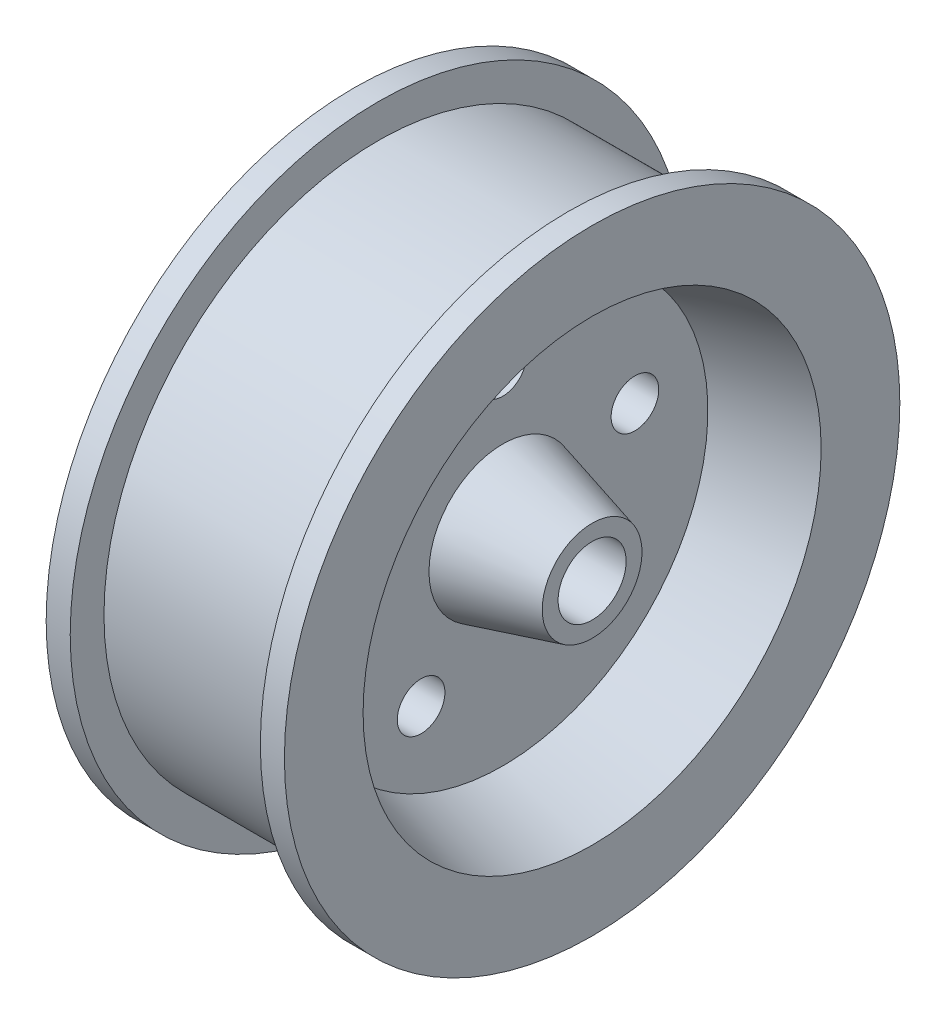
ISO-10303-21;
HEADER;
FILE_DESCRIPTION(('STEP AP214'),'2;1');
FILE_NAME('part.step','',(''),(''),'','','');
FILE_SCHEMA(('AUTOMOTIVE_DESIGN { 1 0 10303 214 1 1 1 1 }'));
ENDSEC;
DATA;
#1=APPLICATION_CONTEXT('core data for automotive mechanical design processes');
#2=APPLICATION_PROTOCOL_DEFINITION('international standard','automotive_design',2000,#1);
#3=PRODUCT_CONTEXT('',#1,'mechanical');
#4=PRODUCT('Part','Part','',(#3));
#5=PRODUCT_RELATED_PRODUCT_CATEGORY('part','',(#4));
#6=PRODUCT_DEFINITION_FORMATION('','',#4);
#7=PRODUCT_DEFINITION_CONTEXT('part definition',#1,'design');
#8=PRODUCT_DEFINITION('design','',#6,#7);
#9=PRODUCT_DEFINITION_SHAPE('','',#8);
#10=(LENGTH_UNIT() NAMED_UNIT(*) SI_UNIT(.MILLI.,.METRE.));
#11=(NAMED_UNIT(*) PLANE_ANGLE_UNIT() SI_UNIT($,.RADIAN.));
#12=(NAMED_UNIT(*) SI_UNIT($,.STERADIAN.) SOLID_ANGLE_UNIT());
#13=UNCERTAINTY_MEASURE_WITH_UNIT(LENGTH_MEASURE(1.E-05),#10,'distance_accuracy_value','');
#14=(GEOMETRIC_REPRESENTATION_CONTEXT(3) GLOBAL_UNCERTAINTY_ASSIGNED_CONTEXT((#13)) GLOBAL_UNIT_ASSIGNED_CONTEXT((#10,
#11,#12)) REPRESENTATION_CONTEXT('',''));
#15=CARTESIAN_POINT('',(0.,0.,0.));
#16=DIRECTION('',(0.,0.,1.));
#17=DIRECTION('',(1.,0.,0.));
#18=AXIS2_PLACEMENT_3D('',#15,#16,#17);
#19=CARTESIAN_POINT('',(0.,15.9532019704434,0.));
#20=DIRECTION('',(1.,0.,0.));
#21=DIRECTION('',(0.,0.,-1.));
#22=AXIS2_PLACEMENT_3D('',#19,#20,#21);
#23=PLANE('',#22);
#24=CARTESIAN_POINT('',(0.,0.,0.));
#25=DIRECTION('',(-1.,0.,0.));
#26=DIRECTION('',(0.,0.,1.));
#27=AXIS2_PLACEMENT_3D('',#24,#25,#26);
#28=CIRCLE('',#27,10.8857142857143);
#29=CARTESIAN_POINT('',(0.,0.,10.8857142857143));
#30=VERTEX_POINT('',#29);
#31=EDGE_CURVE('E10',#30,#30,#28,.T.);
#32=ORIENTED_EDGE('',*,*,#31,.F.);
#33=EDGE_LOOP('',(#32));
#34=FACE_BOUND('',#33,.T.);
#35=CARTESIAN_POINT('',(0.,0.,0.));
#36=DIRECTION('',(-1.,0.,0.));
#37=DIRECTION('',(0.,0.,1.));
#38=AXIS2_PLACEMENT_3D('',#35,#36,#37);
#39=CIRCLE('',#38,15.9532019704434);
#40=CARTESIAN_POINT('',(0.,0.,15.9532019704434));
#41=VERTEX_POINT('',#40);
#42=EDGE_CURVE('E110',#41,#41,#39,.T.);
#43=ORIENTED_EDGE('',*,*,#42,.T.);
#44=EDGE_LOOP('',(#43));
#45=FACE_BOUND('',#44,.T.);
#46=ADVANCED_FACE('F43',(#34,#45),#23,.F.);
#47=CARTESIAN_POINT('',(0.,0.,0.));
#48=DIRECTION('',(-1.,0.,0.));
#49=DIRECTION('',(0.,0.,1.));
#50=AXIS2_PLACEMENT_3D('',#47,#48,#49);
#51=CYLINDRICAL_SURFACE('',#50,10.8857142857143);
#52=CARTESIAN_POINT('',(76.2,0.,0.));
#53=DIRECTION('',(-1.,0.,0.));
#54=DIRECTION('',(0.,0.,1.));
#55=AXIS2_PLACEMENT_3D('',#52,#53,#54);
#56=CIRCLE('',#55,10.8857142857143);
#57=CARTESIAN_POINT('',(76.2,0.,10.8857142857143));
#58=VERTEX_POINT('',#57);
#59=EDGE_CURVE('E50',#58,#58,#56,.T.);
#60=ORIENTED_EDGE('',*,*,#59,.F.);
#61=EDGE_LOOP('',(#60));
#62=FACE_BOUND('',#61,.T.);
#63=ORIENTED_EDGE('',*,*,#31,.T.);
#64=EDGE_LOOP('',(#63));
#65=FACE_BOUND('',#64,.T.);
#66=ADVANCED_FACE('F244',(#62,#65),#51,.F.);
#67=CARTESIAN_POINT('',(76.2,15.9532019704434,0.));
#68=DIRECTION('',(-1.,0.,0.));
#69=DIRECTION('',(0.,0.,1.));
#70=AXIS2_PLACEMENT_3D('',#67,#68,#69);
#71=PLANE('',#70);
#72=CARTESIAN_POINT('',(76.2,0.,0.));
#73=DIRECTION('',(-1.,0.,0.));
#74=DIRECTION('',(0.,0.,1.));
#75=AXIS2_PLACEMENT_3D('',#72,#73,#74);
#76=CIRCLE('',#75,15.9532019704434);
#77=CARTESIAN_POINT('',(76.2,0.,15.9532019704434));
#78=VERTEX_POINT('',#77);
#79=EDGE_CURVE('E55',#78,#78,#76,.T.);
#80=ORIENTED_EDGE('',*,*,#79,.F.);
#81=EDGE_LOOP('',(#80));
#82=FACE_BOUND('',#81,.T.);
#83=ORIENTED_EDGE('',*,*,#59,.T.);
#84=EDGE_LOOP('',(#83));
#85=FACE_BOUND('',#84,.T.);
#86=ADVANCED_FACE('F239',(#82,#85),#71,.F.);
#87=CARTESIAN_POINT('',(76.2,0.,0.));
#88=DIRECTION('',(-1.,0.,0.));
#89=DIRECTION('',(0.,0.,1.));
#90=AXIS2_PLACEMENT_3D('',#87,#88,#89);
#91=CONICAL_SURFACE('',#90,15.9532019704434,0.261799387799147);
#92=CARTESIAN_POINT('',(47.625,0.,0.));
#93=DIRECTION('',(-1.,0.,0.));
#94=DIRECTION('',(0.,0.,1.));
#95=AXIS2_PLACEMENT_3D('',#92,#93,#94);
#96=CIRCLE('',#95,23.6098501441626);
#97=CARTESIAN_POINT('',(47.625,0.,23.6098501441626));
#98=VERTEX_POINT('',#97);
#99=EDGE_CURVE('E60',#98,#98,#96,.T.);
#100=ORIENTED_EDGE('',*,*,#99,.F.);
#101=EDGE_LOOP('',(#100));
#102=FACE_BOUND('',#101,.T.);
#103=ORIENTED_EDGE('',*,*,#79,.T.);
#104=EDGE_LOOP('',(#103));
#105=FACE_BOUND('',#104,.T.);
#106=ADVANCED_FACE('F232',(#102,#105),#91,.T.);
#107=CARTESIAN_POINT('',(47.625,65.5989537967241,0.));
#108=DIRECTION('',(-1.,0.,0.));
#109=DIRECTION('',(0.,0.,1.));
#110=AXIS2_PLACEMENT_3D('',#107,#108,#109);
#111=PLANE('',#110);
#112=CARTESIAN_POINT('',(47.625,13.7358053999663,-42.2744621493196));
#113=DIRECTION('',(-1.,0.,0.));
#114=DIRECTION('',(0.,0.,1.));
#115=AXIS2_PLACEMENT_3D('',#112,#113,#114);
#116=CIRCLE('',#115,7.62);
#117=CARTESIAN_POINT('',(47.625,13.7358053999663,-34.6544621493196));
#118=VERTEX_POINT('',#117);
#119=EDGE_CURVE('E122',#118,#118,#116,.T.);
#120=ORIENTED_EDGE('',*,*,#119,.T.);
#121=EDGE_LOOP('',(#120));
#122=FACE_BOUND('',#121,.T.);
#123=CARTESIAN_POINT('',(47.625,-35.9608053999666,-26.1270544644002));
#124=DIRECTION('',(-1.,0.,0.));
#125=DIRECTION('',(0.,0.,1.));
#126=AXIS2_PLACEMENT_3D('',#123,#124,#125);
#127=CIRCLE('',#126,7.62);
#128=CARTESIAN_POINT('',(47.625,-35.9608053999666,-18.5070544644002));
#129=VERTEX_POINT('',#128);
#130=EDGE_CURVE('E126',#129,#129,#127,.T.);
#131=ORIENTED_EDGE('',*,*,#130,.T.);
#132=EDGE_LOOP('',(#131));
#133=FACE_BOUND('',#132,.T.);
#134=CARTESIAN_POINT('',(47.625,-35.9608053999662,26.1270544644007));
#135=DIRECTION('',(-1.,0.,0.));
#136=DIRECTION('',(0.,0.,1.));
#137=AXIS2_PLACEMENT_3D('',#134,#135,#136);
#138=CIRCLE('',#137,7.62);
#139=CARTESIAN_POINT('',(47.625,-35.9608053999662,33.7470544644007));
#140=VERTEX_POINT('',#139);
#141=EDGE_CURVE('E130',#140,#140,#138,.T.);
#142=ORIENTED_EDGE('',*,*,#141,.T.);
#143=EDGE_LOOP('',(#142));
#144=FACE_BOUND('',#143,.T.);
#145=CARTESIAN_POINT('',(47.625,13.7358053999669,42.2744621493194));
#146=DIRECTION('',(-1.,0.,0.));
#147=DIRECTION('',(0.,0.,1.));
#148=AXIS2_PLACEMENT_3D('',#145,#146,#147);
#149=CIRCLE('',#148,7.62);
#150=CARTESIAN_POINT('',(47.625,13.7358053999669,49.8944621493194));
#151=VERTEX_POINT('',#150);
#152=EDGE_CURVE('E134',#151,#151,#149,.T.);
#153=ORIENTED_EDGE('',*,*,#152,.T.);
#154=EDGE_LOOP('',(#153));
#155=FACE_BOUND('',#154,.T.);
#156=CARTESIAN_POINT('',(47.625,44.45,0.));
#157=DIRECTION('',(-1.,0.,0.));
#158=DIRECTION('',(0.,0.,1.));
#159=AXIS2_PLACEMENT_3D('',#156,#157,#158);
#160=CIRCLE('',#159,7.62);
#161=CARTESIAN_POINT('',(47.625,44.45,7.62));
#162=VERTEX_POINT('',#161);
#163=EDGE_CURVE('E114',#162,#162,#160,.T.);
#164=ORIENTED_EDGE('',*,*,#163,.T.);
#165=EDGE_LOOP('',(#164));
#166=FACE_BOUND('',#165,.T.);
#167=CARTESIAN_POINT('',(47.625,0.,0.));
#168=DIRECTION('',(-1.,0.,0.));
#169=DIRECTION('',(0.,0.,1.));
#170=AXIS2_PLACEMENT_3D('',#167,#168,#169);
#171=CIRCLE('',#170,65.5989537967241);
#172=CARTESIAN_POINT('',(47.625,0.,65.5989537967241));
#173=VERTEX_POINT('',#172);
#174=EDGE_CURVE('E66',#173,#173,#171,.T.);
#175=ORIENTED_EDGE('',*,*,#174,.F.);
#176=EDGE_LOOP('',(#175));
#177=FACE_BOUND('',#176,.T.);
#178=ORIENTED_EDGE('',*,*,#99,.T.);
#179=EDGE_LOOP('',(#178));
#180=FACE_BOUND('',#179,.T.);
#181=ADVANCED_FACE('F226',(#122,#133,#144,#155,#166,#177,#180),#111,.F.);
#182=CARTESIAN_POINT('',(47.625,0.,0.));
#183=DIRECTION('',(1.,0.,0.));
#184=DIRECTION('',(0.,0.,-1.));
#185=AXIS2_PLACEMENT_3D('',#182,#183,#184);
#186=CONICAL_SURFACE('',#185,65.5989537967241,0.261799387799146);
#187=CARTESIAN_POINT('',(76.2,0.,0.));
#188=DIRECTION('',(-1.,0.,0.));
#189=DIRECTION('',(0.,0.,1.));
#190=AXIS2_PLACEMENT_3D('',#187,#188,#189);
#191=CIRCLE('',#190,73.2556019704434);
#192=CARTESIAN_POINT('',(76.2,0.,73.2556019704434));
#193=VERTEX_POINT('',#192);
#194=EDGE_CURVE('E70',#193,#193,#191,.T.);
#195=ORIENTED_EDGE('',*,*,#194,.F.);
#196=EDGE_LOOP('',(#195));
#197=FACE_BOUND('',#196,.T.);
#198=ORIENTED_EDGE('',*,*,#174,.T.);
#199=EDGE_LOOP('',(#198));
#200=FACE_BOUND('',#199,.T.);
#201=ADVANCED_FACE('F220',(#197,#200),#186,.F.);
#202=CARTESIAN_POINT('',(76.2,98.425,0.));
#203=DIRECTION('',(-1.,0.,0.));
#204=DIRECTION('',(0.,0.,1.));
#205=AXIS2_PLACEMENT_3D('',#202,#203,#204);
#206=PLANE('',#205);
#207=CARTESIAN_POINT('',(76.2,0.,0.));
#208=DIRECTION('',(-1.,0.,0.));
#209=DIRECTION('',(0.,0.,1.));
#210=AXIS2_PLACEMENT_3D('',#207,#208,#209);
#211=CIRCLE('',#210,98.425);
#212=CARTESIAN_POINT('',(76.2,0.,98.425));
#213=VERTEX_POINT('',#212);
#214=EDGE_CURVE('E74',#213,#213,#211,.T.);
#215=ORIENTED_EDGE('',*,*,#214,.F.);
#216=EDGE_LOOP('',(#215));
#217=FACE_BOUND('',#216,.T.);
#218=ORIENTED_EDGE('',*,*,#194,.T.);
#219=EDGE_LOOP('',(#218));
#220=FACE_BOUND('',#219,.T.);
#221=ADVANCED_FACE('F214',(#217,#220),#206,.F.);
#222=CARTESIAN_POINT('',(0.,0.,0.));
#223=DIRECTION('',(-1.,0.,0.));
#224=DIRECTION('',(0.,0.,1.));
#225=AXIS2_PLACEMENT_3D('',#222,#223,#224);
#226=CYLINDRICAL_SURFACE('',#225,98.425);
#227=CARTESIAN_POINT('',(68.5049261083744,0.,0.));
#228=DIRECTION('',(-1.,0.,0.));
#229=DIRECTION('',(0.,0.,1.));
#230=AXIS2_PLACEMENT_3D('',#227,#228,#229);
#231=CIRCLE('',#230,98.425);
#232=CARTESIAN_POINT('',(68.5049261083744,0.,98.425));
#233=VERTEX_POINT('',#232);
#234=EDGE_CURVE('E78',#233,#233,#231,.T.);
#235=ORIENTED_EDGE('',*,*,#234,.F.);
#236=EDGE_LOOP('',(#235));
#237=FACE_BOUND('',#236,.T.);
#238=ORIENTED_EDGE('',*,*,#214,.T.);
#239=EDGE_LOOP('',(#238));
#240=FACE_BOUND('',#239,.T.);
#241=ADVANCED_FACE('F208',(#237,#240),#226,.T.);
#242=CARTESIAN_POINT('',(68.5049261083744,87.63,0.));
#243=DIRECTION('',(1.,0.,0.));
#244=DIRECTION('',(0.,0.,-1.));
#245=AXIS2_PLACEMENT_3D('',#242,#243,#244);
#246=PLANE('',#245);
#247=CARTESIAN_POINT('',(68.5049261083744,0.,0.));
#248=DIRECTION('',(-1.,0.,0.));
#249=DIRECTION('',(0.,0.,1.));
#250=AXIS2_PLACEMENT_3D('',#247,#248,#249);
#251=CIRCLE('',#250,87.63);
#252=CARTESIAN_POINT('',(68.5049261083744,0.,87.63));
#253=VERTEX_POINT('',#252);
#254=EDGE_CURVE('E82',#253,#253,#251,.T.);
#255=ORIENTED_EDGE('',*,*,#254,.F.);
#256=EDGE_LOOP('',(#255));
#257=FACE_BOUND('',#256,.T.);
#258=ORIENTED_EDGE('',*,*,#234,.T.);
#259=EDGE_LOOP('',(#258));
#260=FACE_BOUND('',#259,.T.);
#261=ADVANCED_FACE('F202',(#257,#260),#246,.F.);
#262=CARTESIAN_POINT('',(0.,0.,0.));
#263=DIRECTION('',(-1.,0.,0.));
#264=DIRECTION('',(0.,0.,1.));
#265=AXIS2_PLACEMENT_3D('',#262,#263,#264);
#266=CYLINDRICAL_SURFACE('',#265,87.63);
#267=CARTESIAN_POINT('',(7.69507389162563,0.,0.));
#268=DIRECTION('',(-1.,0.,0.));
#269=DIRECTION('',(0.,0.,1.));
#270=AXIS2_PLACEMENT_3D('',#267,#268,#269);
#271=CIRCLE('',#270,87.63);
#272=CARTESIAN_POINT('',(7.69507389162563,0.,87.63));
#273=VERTEX_POINT('',#272);
#274=EDGE_CURVE('E86',#273,#273,#271,.T.);
#275=ORIENTED_EDGE('',*,*,#274,.F.);
#276=EDGE_LOOP('',(#275));
#277=FACE_BOUND('',#276,.T.);
#278=ORIENTED_EDGE('',*,*,#254,.T.);
#279=EDGE_LOOP('',(#278));
#280=FACE_BOUND('',#279,.T.);
#281=ADVANCED_FACE('F196',(#277,#280),#266,.T.);
#282=CARTESIAN_POINT('',(7.69507389162563,87.63,0.));
#283=DIRECTION('',(-1.,0.,0.));
#284=DIRECTION('',(0.,0.,1.));
#285=AXIS2_PLACEMENT_3D('',#282,#283,#284);
#286=PLANE('',#285);
#287=CARTESIAN_POINT('',(7.69507389162563,0.,0.));
#288=DIRECTION('',(-1.,0.,0.));
#289=DIRECTION('',(0.,0.,1.));
#290=AXIS2_PLACEMENT_3D('',#287,#288,#289);
#291=CIRCLE('',#290,98.425);
#292=CARTESIAN_POINT('',(7.69507389162563,0.,98.425));
#293=VERTEX_POINT('',#292);
#294=EDGE_CURVE('E90',#293,#293,#291,.T.);
#295=ORIENTED_EDGE('',*,*,#294,.F.);
#296=EDGE_LOOP('',(#295));
#297=FACE_BOUND('',#296,.T.);
#298=ORIENTED_EDGE('',*,*,#274,.T.);
#299=EDGE_LOOP('',(#298));
#300=FACE_BOUND('',#299,.T.);
#301=ADVANCED_FACE('F190',(#297,#300),#286,.F.);
#302=CARTESIAN_POINT('',(0.,0.,0.));
#303=DIRECTION('',(-1.,0.,0.));
#304=DIRECTION('',(0.,0.,1.));
#305=AXIS2_PLACEMENT_3D('',#302,#303,#304);
#306=CYLINDRICAL_SURFACE('',#305,98.425);
#307=CARTESIAN_POINT('',(0.,0.,0.));
#308=DIRECTION('',(-1.,0.,0.));
#309=DIRECTION('',(0.,0.,1.));
#310=AXIS2_PLACEMENT_3D('',#307,#308,#309);
#311=CIRCLE('',#310,98.425);
#312=CARTESIAN_POINT('',(0.,0.,98.425));
#313=VERTEX_POINT('',#312);
#314=EDGE_CURVE('E94',#313,#313,#311,.T.);
#315=ORIENTED_EDGE('',*,*,#314,.F.);
#316=EDGE_LOOP('',(#315));
#317=FACE_BOUND('',#316,.T.);
#318=ORIENTED_EDGE('',*,*,#294,.T.);
#319=EDGE_LOOP('',(#318));
#320=FACE_BOUND('',#319,.T.);
#321=ADVANCED_FACE('F184',(#317,#320),#306,.T.);
#322=CARTESIAN_POINT('',(0.,98.425,0.));
#323=DIRECTION('',(1.,0.,0.));
#324=DIRECTION('',(0.,0.,-1.));
#325=AXIS2_PLACEMENT_3D('',#322,#323,#324);
#326=PLANE('',#325);
#327=CARTESIAN_POINT('',(0.,0.,0.));
#328=DIRECTION('',(-1.,0.,0.));
#329=DIRECTION('',(0.,0.,1.));
#330=AXIS2_PLACEMENT_3D('',#327,#328,#329);
#331=CIRCLE('',#330,73.2556019704434);
#332=CARTESIAN_POINT('',(0.,0.,73.2556019704434));
#333=VERTEX_POINT('',#332);
#334=EDGE_CURVE('E98',#333,#333,#331,.T.);
#335=ORIENTED_EDGE('',*,*,#334,.F.);
#336=EDGE_LOOP('',(#335));
#337=FACE_BOUND('',#336,.T.);
#338=ORIENTED_EDGE('',*,*,#314,.T.);
#339=EDGE_LOOP('',(#338));
#340=FACE_BOUND('',#339,.T.);
#341=ADVANCED_FACE('F178',(#337,#340),#326,.F.);
#342=CARTESIAN_POINT('',(0.,0.,0.));
#343=DIRECTION('',(-1.,0.,0.));
#344=DIRECTION('',(0.,0.,1.));
#345=AXIS2_PLACEMENT_3D('',#342,#343,#344);
#346=CONICAL_SURFACE('',#345,73.2556019704434,0.261799387799146);
#347=CARTESIAN_POINT('',(28.575,0.,0.));
#348=DIRECTION('',(-1.,0.,0.));
#349=DIRECTION('',(0.,0.,1.));
#350=AXIS2_PLACEMENT_3D('',#347,#348,#349);
#351=CIRCLE('',#350,65.5989537967241);
#352=CARTESIAN_POINT('',(28.575,0.,65.5989537967241));
#353=VERTEX_POINT('',#352);
#354=EDGE_CURVE('E102',#353,#353,#351,.T.);
#355=ORIENTED_EDGE('',*,*,#354,.F.);
#356=EDGE_LOOP('',(#355));
#357=FACE_BOUND('',#356,.T.);
#358=ORIENTED_EDGE('',*,*,#334,.T.);
#359=EDGE_LOOP('',(#358));
#360=FACE_BOUND('',#359,.T.);
#361=ADVANCED_FACE('F162',(#357,#360),#346,.F.);
#362=CARTESIAN_POINT('',(28.575,65.5989537967241,0.));
#363=DIRECTION('',(1.,0.,0.));
#364=DIRECTION('',(0.,0.,-1.));
#365=AXIS2_PLACEMENT_3D('',#362,#363,#364);
#366=PLANE('',#365);
#367=CARTESIAN_POINT('',(28.575,13.7358053999663,-42.2744621493196));
#368=DIRECTION('',(-1.,0.,0.));
#369=DIRECTION('',(0.,0.951056516295155,0.309016994374945));
#370=AXIS2_PLACEMENT_3D('',#367,#368,#369);
#371=CIRCLE('',#370,7.62);
#372=CARTESIAN_POINT('',(28.575,20.9828560541354,-39.9197526521825));
#373=VERTEX_POINT('',#372);
#374=EDGE_CURVE('E138',#373,#373,#371,.T.);
#375=ORIENTED_EDGE('',*,*,#374,.F.);
#376=EDGE_LOOP('',(#375));
#377=FACE_BOUND('',#376,.T.);
#378=CARTESIAN_POINT('',(28.575,-35.9608053999666,-26.1270544644002));
#379=DIRECTION('',(-1.,0.,0.));
#380=DIRECTION('',(0.,0.587785252292469,-0.809016994374951));
#381=AXIS2_PLACEMENT_3D('',#378,#379,#380);
#382=CIRCLE('',#381,7.62);
#383=CARTESIAN_POINT('',(28.575,-31.4818817774979,-32.2917639615373));
#384=VERTEX_POINT('',#383);
#385=EDGE_CURVE('E147',#384,#384,#382,.T.);
#386=ORIENTED_EDGE('',*,*,#385,.F.);
#387=EDGE_LOOP('',(#386));
#388=FACE_BOUND('',#387,.T.);
#389=CARTESIAN_POINT('',(28.575,-35.9608053999662,26.1270544644007));
#390=DIRECTION('',(-1.,0.,0.));
#391=DIRECTION('',(0.,-0.58778525229248,-0.809016994374942));
#392=AXIS2_PLACEMENT_3D('',#389,#390,#391);
#393=CIRCLE('',#392,7.62);
#394=CARTESIAN_POINT('',(28.575,-40.4397290224349,19.9623449672637));
#395=VERTEX_POINT('',#394);
#396=EDGE_CURVE('E143',#395,#395,#393,.T.);
#397=ORIENTED_EDGE('',*,*,#396,.F.);
#398=EDGE_LOOP('',(#397));
#399=FACE_BOUND('',#398,.T.);
#400=CARTESIAN_POINT('',(28.575,13.7358053999669,42.2744621493194));
#401=DIRECTION('',(-1.,0.,0.));
#402=DIRECTION('',(0.,-0.95105651629515,0.309016994374958));
#403=AXIS2_PLACEMENT_3D('',#400,#401,#402);
#404=CIRCLE('',#403,7.62);
#405=CARTESIAN_POINT('',(28.575,6.48875474579785,44.6291716464566));
#406=VERTEX_POINT('',#405);
#407=EDGE_CURVE('E139',#406,#406,#404,.T.);
#408=ORIENTED_EDGE('',*,*,#407,.F.);
#409=EDGE_LOOP('',(#408));
#410=FACE_BOUND('',#409,.T.);
#411=CARTESIAN_POINT('',(28.575,44.45,0.));
#412=DIRECTION('',(-1.,0.,0.));
#413=DIRECTION('',(0.,0.,1.));
#414=AXIS2_PLACEMENT_3D('',#411,#412,#413);
#415=CIRCLE('',#414,7.62);
#416=CARTESIAN_POINT('',(28.575,44.45,7.62));
#417=VERTEX_POINT('',#416);
#418=EDGE_CURVE('E118',#417,#417,#415,.T.);
#419=ORIENTED_EDGE('',*,*,#418,.F.);
#420=EDGE_LOOP('',(#419));
#421=FACE_BOUND('',#420,.T.);
#422=CARTESIAN_POINT('',(28.575,0.,0.));
#423=DIRECTION('',(-1.,0.,0.));
#424=DIRECTION('',(0.,0.,1.));
#425=AXIS2_PLACEMENT_3D('',#422,#423,#424);
#426=CIRCLE('',#425,23.6098501441626);
#427=CARTESIAN_POINT('',(28.575,0.,23.6098501441626));
#428=VERTEX_POINT('',#427);
#429=EDGE_CURVE('E106',#428,#428,#426,.T.);
#430=ORIENTED_EDGE('',*,*,#429,.F.);
#431=EDGE_LOOP('',(#430));
#432=FACE_BOUND('',#431,.T.);
#433=ORIENTED_EDGE('',*,*,#354,.T.);
#434=EDGE_LOOP('',(#433));
#435=FACE_BOUND('',#434,.T.);
#436=ADVANCED_FACE('F158',(#377,#388,#399,#410,#421,#432,#435),#366,.F.);
#437=CARTESIAN_POINT('',(28.575,0.,0.));
#438=DIRECTION('',(1.,0.,0.));
#439=DIRECTION('',(0.,0.,-1.));
#440=AXIS2_PLACEMENT_3D('',#437,#438,#439);
#441=CONICAL_SURFACE('',#440,23.6098501441626,0.261799387799147);
#442=ORIENTED_EDGE('',*,*,#42,.F.);
#443=EDGE_LOOP('',(#442));
#444=FACE_BOUND('',#443,.T.);
#445=ORIENTED_EDGE('',*,*,#429,.T.);
#446=EDGE_LOOP('',(#445));
#447=FACE_BOUND('',#446,.T.);
#448=ADVANCED_FACE('F161',(#444,#447),#441,.T.);
#449=CARTESIAN_POINT('',(190.575,44.45,0.));
#450=DIRECTION('',(-1.,0.,0.));
#451=DIRECTION('',(0.,0.,1.));
#452=AXIS2_PLACEMENT_3D('',#449,#450,#451);
#453=CYLINDRICAL_SURFACE('',#452,7.62);
#454=ORIENTED_EDGE('',*,*,#418,.T.);
#455=EDGE_LOOP('',(#454));
#456=FACE_BOUND('',#455,.T.);
#457=ORIENTED_EDGE('',*,*,#163,.F.);
#458=EDGE_LOOP('',(#457));
#459=FACE_BOUND('',#458,.T.);
#460=ADVANCED_FACE('F259',(#456,#459),#453,.F.);
#461=CARTESIAN_POINT('',(190.575,13.7358053999669,42.2744621493194));
#462=DIRECTION('',(-1.,0.,0.));
#463=DIRECTION('',(0.,0.,1.));
#464=AXIS2_PLACEMENT_3D('',#461,#462,#463);
#465=CYLINDRICAL_SURFACE('',#464,7.62);
#466=ORIENTED_EDGE('',*,*,#407,.T.);
#467=EDGE_LOOP('',(#466));
#468=FACE_BOUND('',#467,.T.);
#469=ORIENTED_EDGE('',*,*,#152,.F.);
#470=EDGE_LOOP('',(#469));
#471=FACE_BOUND('',#470,.T.);
#472=ADVANCED_FACE('F264',(#468,#471),#465,.F.);
#473=CARTESIAN_POINT('',(190.575,-35.9608053999662,26.1270544644007));
#474=DIRECTION('',(-1.,0.,0.));
#475=DIRECTION('',(0.,0.,1.));
#476=AXIS2_PLACEMENT_3D('',#473,#474,#475);
#477=CYLINDRICAL_SURFACE('',#476,7.62);
#478=ORIENTED_EDGE('',*,*,#396,.T.);
#479=EDGE_LOOP('',(#478));
#480=FACE_BOUND('',#479,.T.);
#481=ORIENTED_EDGE('',*,*,#141,.F.);
#482=EDGE_LOOP('',(#481));
#483=FACE_BOUND('',#482,.T.);
#484=ADVANCED_FACE('F270',(#480,#483),#477,.F.);
#485=CARTESIAN_POINT('',(190.575,-35.9608053999666,-26.1270544644002));
#486=DIRECTION('',(-1.,0.,0.));
#487=DIRECTION('',(0.,0.,1.));
#488=AXIS2_PLACEMENT_3D('',#485,#486,#487);
#489=CYLINDRICAL_SURFACE('',#488,7.62);
#490=ORIENTED_EDGE('',*,*,#385,.T.);
#491=EDGE_LOOP('',(#490));
#492=FACE_BOUND('',#491,.T.);
#493=ORIENTED_EDGE('',*,*,#130,.F.);
#494=EDGE_LOOP('',(#493));
#495=FACE_BOUND('',#494,.T.);
#496=ADVANCED_FACE('F274',(#492,#495),#489,.F.);
#497=CARTESIAN_POINT('',(190.575,13.7358053999663,-42.2744621493196));
#498=DIRECTION('',(-1.,0.,0.));
#499=DIRECTION('',(0.,0.,1.));
#500=AXIS2_PLACEMENT_3D('',#497,#498,#499);
#501=CYLINDRICAL_SURFACE('',#500,7.62);
#502=ORIENTED_EDGE('',*,*,#374,.T.);
#503=EDGE_LOOP('',(#502));
#504=FACE_BOUND('',#503,.T.);
#505=ORIENTED_EDGE('',*,*,#119,.F.);
#506=EDGE_LOOP('',(#505));
#507=FACE_BOUND('',#506,.T.);
#508=ADVANCED_FACE('F155',(#504,#507),#501,.F.);
#509=CLOSED_SHELL('',(#46,#66,#86,#106,#181,#201,#221,#241,#261,#281,#301,#321,#341,#361,#436,
#448,#460,#472,#484,#496,#508));
#510=MANIFOLD_SOLID_BREP('B2',#509);
#511=ADVANCED_BREP_SHAPE_REPRESENTATION('',(#18,#510),#14);
#512=SHAPE_DEFINITION_REPRESENTATION(#9,#511);
ENDSEC;
END-ISO-10303-21;
